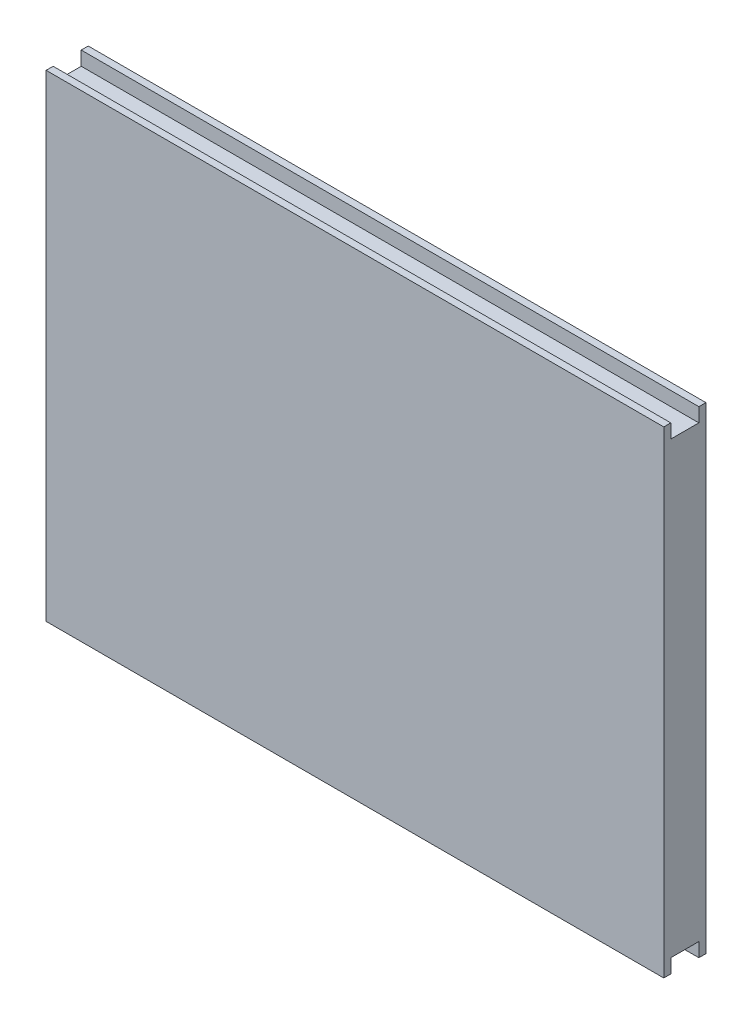
ISO-10303-21;
HEADER;
FILE_DESCRIPTION(('STEP AP214'),'2;1');
FILE_NAME('part.step','',(''),(''),'','','');
FILE_SCHEMA(('AUTOMOTIVE_DESIGN { 1 0 10303 214 1 1 1 1 }'));
ENDSEC;
DATA;
#1=APPLICATION_CONTEXT('core data for automotive mechanical design processes');
#2=APPLICATION_PROTOCOL_DEFINITION('international standard','automotive_design',2000,#1);
#3=PRODUCT_CONTEXT('',#1,'mechanical');
#4=PRODUCT('Part','Part','',(#3));
#5=PRODUCT_RELATED_PRODUCT_CATEGORY('part','',(#4));
#6=PRODUCT_DEFINITION_FORMATION('','',#4);
#7=PRODUCT_DEFINITION_CONTEXT('part definition',#1,'design');
#8=PRODUCT_DEFINITION('design','',#6,#7);
#9=PRODUCT_DEFINITION_SHAPE('','',#8);
#10=(LENGTH_UNIT() NAMED_UNIT(*) SI_UNIT(.MILLI.,.METRE.));
#11=(NAMED_UNIT(*) PLANE_ANGLE_UNIT() SI_UNIT($,.RADIAN.));
#12=(NAMED_UNIT(*) SI_UNIT($,.STERADIAN.) SOLID_ANGLE_UNIT());
#13=UNCERTAINTY_MEASURE_WITH_UNIT(LENGTH_MEASURE(1.E-05),#10,'distance_accuracy_value','');
#14=(GEOMETRIC_REPRESENTATION_CONTEXT(3) GLOBAL_UNCERTAINTY_ASSIGNED_CONTEXT((#13)) GLOBAL_UNIT_ASSIGNED_CONTEXT((#10,
#11,#12)) REPRESENTATION_CONTEXT('',''));
#15=CARTESIAN_POINT('',(0.,0.,0.));
#16=DIRECTION('',(0.,0.,1.));
#17=DIRECTION('',(1.,0.,0.));
#18=AXIS2_PLACEMENT_3D('',#15,#16,#17);
#19=CARTESIAN_POINT('',(220.,-80.,-5.));
#20=DIRECTION('',(0.,0.,-1.));
#21=DIRECTION('',(-1.,0.,0.));
#22=AXIS2_PLACEMENT_3D('',#19,#20,#21);
#23=PLANE('',#22);
#24=DIRECTION('',(0.,-1.,0.));
#25=VECTOR('',#24,1.);
#26=CARTESIAN_POINT('',(0.,-80.,-5.));
#27=LINE('',#26,#25);
#28=CARTESIAN_POINT('',(0.,-80.,-5.));
#29=VERTEX_POINT('',#28);
#30=CARTESIAN_POINT('',(0.,-85.,-5.));
#31=VERTEX_POINT('',#30);
#32=EDGE_CURVE('E154',#29,#31,#27,.T.);
#33=ORIENTED_EDGE('',*,*,#32,.T.);
#34=DIRECTION('',(-1.,0.,0.));
#35=VECTOR('',#34,1.);
#36=CARTESIAN_POINT('',(220.,-85.,-5.));
#37=LINE('',#36,#35);
#38=CARTESIAN_POINT('',(220.,-85.,-5.));
#39=VERTEX_POINT('',#38);
#40=EDGE_CURVE('E11',#39,#31,#37,.T.);
#41=ORIENTED_EDGE('',*,*,#40,.F.);
#42=DIRECTION('',(0.,-1.,0.));
#43=VECTOR('',#42,1.);
#44=CARTESIAN_POINT('',(220.,-80.,-5.));
#45=LINE('',#44,#43);
#46=CARTESIAN_POINT('',(220.,-80.,-5.));
#47=VERTEX_POINT('',#46);
#48=EDGE_CURVE('E176',#47,#39,#45,.T.);
#49=ORIENTED_EDGE('',*,*,#48,.F.);
#50=DIRECTION('',(-1.,0.,0.));
#51=VECTOR('',#50,1.);
#52=CARTESIAN_POINT('',(220.,-80.,-5.));
#53=LINE('',#52,#51);
#54=EDGE_CURVE('E150',#47,#29,#53,.T.);
#55=ORIENTED_EDGE('',*,*,#54,.T.);
#56=EDGE_LOOP('',(#33,#41,#49,#55));
#57=FACE_BOUND('',#56,.T.);
#58=ADVANCED_FACE('F34',(#57),#23,.F.);
#59=CARTESIAN_POINT('',(220.,-85.,-5.));
#60=DIRECTION('',(0.,1.,0.));
#61=DIRECTION('',(0.,0.,1.));
#62=AXIS2_PLACEMENT_3D('',#59,#60,#61);
#63=PLANE('',#62);
#64=DIRECTION('',(0.,0.,-1.));
#65=VECTOR('',#64,1.);
#66=CARTESIAN_POINT('',(0.,-85.,-5.));
#67=LINE('',#66,#65);
#68=CARTESIAN_POINT('',(0.,-85.,-7.5));
#69=VERTEX_POINT('',#68);
#70=EDGE_CURVE('E157',#31,#69,#67,.T.);
#71=ORIENTED_EDGE('',*,*,#70,.T.);
#72=DIRECTION('',(-1.,0.,0.));
#73=VECTOR('',#72,1.);
#74=CARTESIAN_POINT('',(220.,-85.,-7.5));
#75=LINE('',#74,#73);
#76=CARTESIAN_POINT('',(220.,-85.,-7.5));
#77=VERTEX_POINT('',#76);
#78=EDGE_CURVE('E42',#77,#69,#75,.T.);
#79=ORIENTED_EDGE('',*,*,#78,.F.);
#80=DIRECTION('',(0.,0.,-1.));
#81=VECTOR('',#80,1.);
#82=CARTESIAN_POINT('',(220.,-85.,-5.));
#83=LINE('',#82,#81);
#84=EDGE_CURVE('E105',#39,#77,#83,.T.);
#85=ORIENTED_EDGE('',*,*,#84,.F.);
#86=ORIENTED_EDGE('',*,*,#40,.T.);
#87=EDGE_LOOP('',(#71,#79,#85,#86));
#88=FACE_BOUND('',#87,.T.);
#89=ADVANCED_FACE('F254',(#88),#63,.F.);
#90=CARTESIAN_POINT('',(220.,85.,-7.5));
#91=DIRECTION('',(0.,0.,1.));
#92=DIRECTION('',(0.,-1.,0.));
#93=AXIS2_PLACEMENT_3D('',#90,#91,#92);
#94=PLANE('',#93);
#95=DIRECTION('',(0.,1.,0.));
#96=VECTOR('',#95,1.);
#97=CARTESIAN_POINT('',(0.,85.,-7.5));
#98=LINE('',#97,#96);
#99=CARTESIAN_POINT('',(0.,85.,-7.5));
#100=VERTEX_POINT('',#99);
#101=EDGE_CURVE('E159',#69,#100,#98,.T.);
#102=ORIENTED_EDGE('',*,*,#101,.T.);
#103=DIRECTION('',(-1.,0.,0.));
#104=VECTOR('',#103,1.);
#105=CARTESIAN_POINT('',(220.,85.,-7.5));
#106=LINE('',#105,#104);
#107=CARTESIAN_POINT('',(220.,85.,-7.5));
#108=VERTEX_POINT('',#107);
#109=EDGE_CURVE('E195',#108,#100,#106,.T.);
#110=ORIENTED_EDGE('',*,*,#109,.F.);
#111=DIRECTION('',(0.,1.,0.));
#112=VECTOR('',#111,1.);
#113=CARTESIAN_POINT('',(220.,85.,-7.5));
#114=LINE('',#113,#112);
#115=EDGE_CURVE('E203',#77,#108,#114,.T.);
#116=ORIENTED_EDGE('',*,*,#115,.F.);
#117=ORIENTED_EDGE('',*,*,#78,.T.);
#118=EDGE_LOOP('',(#102,#110,#116,#117));
#119=FACE_BOUND('',#118,.T.);
#120=ADVANCED_FACE('F201',(#119),#94,.F.);
#121=CARTESIAN_POINT('',(220.,85.,-5.));
#122=DIRECTION('',(0.,-1.,0.));
#123=DIRECTION('',(0.,0.,-1.));
#124=AXIS2_PLACEMENT_3D('',#121,#122,#123);
#125=PLANE('',#124);
#126=DIRECTION('',(0.,0.,1.));
#127=VECTOR('',#126,1.);
#128=CARTESIAN_POINT('',(0.,85.,-5.));
#129=LINE('',#128,#127);
#130=CARTESIAN_POINT('',(0.,85.,-5.));
#131=VERTEX_POINT('',#130);
#132=EDGE_CURVE('E161',#100,#131,#129,.T.);
#133=ORIENTED_EDGE('',*,*,#132,.T.);
#134=DIRECTION('',(-1.,0.,0.));
#135=VECTOR('',#134,1.);
#136=CARTESIAN_POINT('',(220.,85.,-5.));
#137=LINE('',#136,#135);
#138=CARTESIAN_POINT('',(220.,85.,-5.));
#139=VERTEX_POINT('',#138);
#140=EDGE_CURVE('E192',#139,#131,#137,.T.);
#141=ORIENTED_EDGE('',*,*,#140,.F.);
#142=DIRECTION('',(0.,0.,1.));
#143=VECTOR('',#142,1.);
#144=CARTESIAN_POINT('',(220.,85.,-5.));
#145=LINE('',#144,#143);
#146=EDGE_CURVE('E221',#108,#139,#145,.T.);
#147=ORIENTED_EDGE('',*,*,#146,.F.);
#148=ORIENTED_EDGE('',*,*,#109,.T.);
#149=EDGE_LOOP('',(#133,#141,#147,#148));
#150=FACE_BOUND('',#149,.T.);
#151=ADVANCED_FACE('F212',(#150),#125,.F.);
#152=CARTESIAN_POINT('',(220.,80.,-5.));
#153=DIRECTION('',(0.,0.,-1.));
#154=DIRECTION('',(-1.,0.,0.));
#155=AXIS2_PLACEMENT_3D('',#152,#153,#154);
#156=PLANE('',#155);
#157=DIRECTION('',(0.,-1.,0.));
#158=VECTOR('',#157,1.);
#159=CARTESIAN_POINT('',(0.,80.,-5.));
#160=LINE('',#159,#158);
#161=CARTESIAN_POINT('',(0.,80.,-5.));
#162=VERTEX_POINT('',#161);
#163=EDGE_CURVE('E163',#131,#162,#160,.T.);
#164=ORIENTED_EDGE('',*,*,#163,.T.);
#165=DIRECTION('',(-1.,0.,0.));
#166=VECTOR('',#165,1.);
#167=CARTESIAN_POINT('',(220.,80.,-5.));
#168=LINE('',#167,#166);
#169=CARTESIAN_POINT('',(220.,80.,-5.));
#170=VERTEX_POINT('',#169);
#171=EDGE_CURVE('E189',#170,#162,#168,.T.);
#172=ORIENTED_EDGE('',*,*,#171,.F.);
#173=DIRECTION('',(0.,-1.,0.));
#174=VECTOR('',#173,1.);
#175=CARTESIAN_POINT('',(220.,80.,-5.));
#176=LINE('',#175,#174);
#177=EDGE_CURVE('E218',#139,#170,#176,.T.);
#178=ORIENTED_EDGE('',*,*,#177,.F.);
#179=ORIENTED_EDGE('',*,*,#140,.T.);
#180=EDGE_LOOP('',(#164,#172,#178,#179));
#181=FACE_BOUND('',#180,.T.);
#182=ADVANCED_FACE('F216',(#181),#156,.F.);
#183=CARTESIAN_POINT('',(220.,80.,5.));
#184=DIRECTION('',(0.,-1.,0.));
#185=DIRECTION('',(0.,0.,-1.));
#186=AXIS2_PLACEMENT_3D('',#183,#184,#185);
#187=PLANE('',#186);
#188=DIRECTION('',(0.,0.,1.));
#189=VECTOR('',#188,1.);
#190=CARTESIAN_POINT('',(0.,80.,5.));
#191=LINE('',#190,#189);
#192=CARTESIAN_POINT('',(0.,80.,5.));
#193=VERTEX_POINT('',#192);
#194=EDGE_CURVE('E165',#162,#193,#191,.T.);
#195=ORIENTED_EDGE('',*,*,#194,.T.);
#196=DIRECTION('',(-1.,0.,0.));
#197=VECTOR('',#196,1.);
#198=CARTESIAN_POINT('',(220.,80.,5.));
#199=LINE('',#198,#197);
#200=CARTESIAN_POINT('',(220.,80.,5.));
#201=VERTEX_POINT('',#200);
#202=EDGE_CURVE('E186',#201,#193,#199,.T.);
#203=ORIENTED_EDGE('',*,*,#202,.F.);
#204=DIRECTION('',(0.,0.,1.));
#205=VECTOR('',#204,1.);
#206=CARTESIAN_POINT('',(220.,80.,5.));
#207=LINE('',#206,#205);
#208=EDGE_CURVE('E220',#170,#201,#207,.T.);
#209=ORIENTED_EDGE('',*,*,#208,.F.);
#210=ORIENTED_EDGE('',*,*,#171,.T.);
#211=EDGE_LOOP('',(#195,#203,#209,#210));
#212=FACE_BOUND('',#211,.T.);
#213=ADVANCED_FACE('F267',(#212),#187,.F.);
#214=CARTESIAN_POINT('',(220.,85.,5.));
#215=DIRECTION('',(0.,0.,1.));
#216=DIRECTION('',(0.,-1.,0.));
#217=AXIS2_PLACEMENT_3D('',#214,#215,#216);
#218=PLANE('',#217);
#219=DIRECTION('',(0.,1.,0.));
#220=VECTOR('',#219,1.);
#221=CARTESIAN_POINT('',(0.,85.,5.));
#222=LINE('',#221,#220);
#223=CARTESIAN_POINT('',(0.,85.,5.));
#224=VERTEX_POINT('',#223);
#225=EDGE_CURVE('E167',#193,#224,#222,.T.);
#226=ORIENTED_EDGE('',*,*,#225,.T.);
#227=DIRECTION('',(-1.,0.,0.));
#228=VECTOR('',#227,1.);
#229=CARTESIAN_POINT('',(220.,85.,5.));
#230=LINE('',#229,#228);
#231=CARTESIAN_POINT('',(220.,85.,5.));
#232=VERTEX_POINT('',#231);
#233=EDGE_CURVE('E183',#232,#224,#230,.T.);
#234=ORIENTED_EDGE('',*,*,#233,.F.);
#235=DIRECTION('',(0.,1.,0.));
#236=VECTOR('',#235,1.);
#237=CARTESIAN_POINT('',(220.,85.,5.));
#238=LINE('',#237,#236);
#239=EDGE_CURVE('E223',#201,#232,#238,.T.);
#240=ORIENTED_EDGE('',*,*,#239,.F.);
#241=ORIENTED_EDGE('',*,*,#202,.T.);
#242=EDGE_LOOP('',(#226,#234,#240,#241));
#243=FACE_BOUND('',#242,.T.);
#244=ADVANCED_FACE('F270',(#243),#218,.F.);
#245=CARTESIAN_POINT('',(220.,85.,5.));
#246=DIRECTION('',(0.,-1.,0.));
#247=DIRECTION('',(0.,0.,-1.));
#248=AXIS2_PLACEMENT_3D('',#245,#246,#247);
#249=PLANE('',#248);
#250=DIRECTION('',(0.,0.,1.));
#251=VECTOR('',#250,1.);
#252=CARTESIAN_POINT('',(0.,85.,5.));
#253=LINE('',#252,#251);
#254=CARTESIAN_POINT('',(0.,85.,7.5));
#255=VERTEX_POINT('',#254);
#256=EDGE_CURVE('E169',#224,#255,#253,.T.);
#257=ORIENTED_EDGE('',*,*,#256,.T.);
#258=DIRECTION('',(-1.,0.,0.));
#259=VECTOR('',#258,1.);
#260=CARTESIAN_POINT('',(220.,85.,7.5));
#261=LINE('',#260,#259);
#262=CARTESIAN_POINT('',(220.,85.,7.5));
#263=VERTEX_POINT('',#262);
#264=EDGE_CURVE('E180',#263,#255,#261,.T.);
#265=ORIENTED_EDGE('',*,*,#264,.F.);
#266=DIRECTION('',(0.,0.,1.));
#267=VECTOR('',#266,1.);
#268=CARTESIAN_POINT('',(220.,85.,5.));
#269=LINE('',#268,#267);
#270=EDGE_CURVE('E229',#232,#263,#269,.T.);
#271=ORIENTED_EDGE('',*,*,#270,.F.);
#272=ORIENTED_EDGE('',*,*,#233,.T.);
#273=EDGE_LOOP('',(#257,#265,#271,#272));
#274=FACE_BOUND('',#273,.T.);
#275=ADVANCED_FACE('F235',(#274),#249,.F.);
#276=CARTESIAN_POINT('',(220.,85.,7.5));
#277=DIRECTION('',(0.,0.,-1.));
#278=DIRECTION('',(0.,1.,0.));
#279=AXIS2_PLACEMENT_3D('',#276,#277,#278);
#280=PLANE('',#279);
#281=DIRECTION('',(0.,-1.,0.));
#282=VECTOR('',#281,1.);
#283=CARTESIAN_POINT('',(0.,85.,7.5));
#284=LINE('',#283,#282);
#285=CARTESIAN_POINT('',(0.,-85.,7.5));
#286=VERTEX_POINT('',#285);
#287=EDGE_CURVE('E171',#255,#286,#284,.T.);
#288=ORIENTED_EDGE('',*,*,#287,.T.);
#289=DIRECTION('',(-1.,0.,0.));
#290=VECTOR('',#289,1.);
#291=CARTESIAN_POINT('',(220.,-85.,7.5));
#292=LINE('',#291,#290);
#293=CARTESIAN_POINT('',(220.,-85.,7.5));
#294=VERTEX_POINT('',#293);
#295=EDGE_CURVE('E145',#294,#286,#292,.T.);
#296=ORIENTED_EDGE('',*,*,#295,.F.);
#297=DIRECTION('',(0.,-1.,0.));
#298=VECTOR('',#297,1.);
#299=CARTESIAN_POINT('',(220.,85.,7.5));
#300=LINE('',#299,#298);
#301=EDGE_CURVE('E136',#263,#294,#300,.T.);
#302=ORIENTED_EDGE('',*,*,#301,.F.);
#303=ORIENTED_EDGE('',*,*,#264,.T.);
#304=EDGE_LOOP('',(#288,#296,#302,#303));
#305=FACE_BOUND('',#304,.T.);
#306=ADVANCED_FACE('F239',(#305),#280,.F.);
#307=CARTESIAN_POINT('',(220.,-85.,5.));
#308=DIRECTION('',(0.,1.,0.));
#309=DIRECTION('',(0.,0.,1.));
#310=AXIS2_PLACEMENT_3D('',#307,#308,#309);
#311=PLANE('',#310);
#312=DIRECTION('',(0.,0.,-1.));
#313=VECTOR('',#312,1.);
#314=CARTESIAN_POINT('',(0.,-85.,5.));
#315=LINE('',#314,#313);
#316=CARTESIAN_POINT('',(0.,-85.,5.));
#317=VERTEX_POINT('',#316);
#318=EDGE_CURVE('E144',#286,#317,#315,.T.);
#319=ORIENTED_EDGE('',*,*,#318,.T.);
#320=DIRECTION('',(-1.,0.,0.));
#321=VECTOR('',#320,1.);
#322=CARTESIAN_POINT('',(220.,-85.,5.));
#323=LINE('',#322,#321);
#324=CARTESIAN_POINT('',(220.,-85.,5.));
#325=VERTEX_POINT('',#324);
#326=EDGE_CURVE('E141',#325,#317,#323,.T.);
#327=ORIENTED_EDGE('',*,*,#326,.F.);
#328=DIRECTION('',(0.,0.,-1.));
#329=VECTOR('',#328,1.);
#330=CARTESIAN_POINT('',(220.,-85.,5.));
#331=LINE('',#330,#329);
#332=EDGE_CURVE('E130',#294,#325,#331,.T.);
#333=ORIENTED_EDGE('',*,*,#332,.F.);
#334=ORIENTED_EDGE('',*,*,#295,.T.);
#335=EDGE_LOOP('',(#319,#327,#333,#334));
#336=FACE_BOUND('',#335,.T.);
#337=ADVANCED_FACE('F142',(#336),#311,.F.);
#338=CARTESIAN_POINT('',(220.,-85.,5.));
#339=DIRECTION('',(0.,0.,1.));
#340=DIRECTION('',(0.,-1.,0.));
#341=AXIS2_PLACEMENT_3D('',#338,#339,#340);
#342=PLANE('',#341);
#343=DIRECTION('',(0.,1.,0.));
#344=VECTOR('',#343,1.);
#345=CARTESIAN_POINT('',(0.,-85.,5.));
#346=LINE('',#345,#344);
#347=CARTESIAN_POINT('',(0.,-80.,5.));
#348=VERTEX_POINT('',#347);
#349=EDGE_CURVE('E91',#317,#348,#346,.T.);
#350=ORIENTED_EDGE('',*,*,#349,.T.);
#351=DIRECTION('',(-1.,0.,0.));
#352=VECTOR('',#351,1.);
#353=CARTESIAN_POINT('',(220.,-80.,5.));
#354=LINE('',#353,#352);
#355=CARTESIAN_POINT('',(220.,-80.,5.));
#356=VERTEX_POINT('',#355);
#357=EDGE_CURVE('E146',#356,#348,#354,.T.);
#358=ORIENTED_EDGE('',*,*,#357,.F.);
#359=DIRECTION('',(0.,1.,0.));
#360=VECTOR('',#359,1.);
#361=CARTESIAN_POINT('',(220.,-85.,5.));
#362=LINE('',#361,#360);
#363=EDGE_CURVE('E134',#325,#356,#362,.T.);
#364=ORIENTED_EDGE('',*,*,#363,.F.);
#365=ORIENTED_EDGE('',*,*,#326,.T.);
#366=EDGE_LOOP('',(#350,#358,#364,#365));
#367=FACE_BOUND('',#366,.T.);
#368=ADVANCED_FACE('F148',(#367),#342,.F.);
#369=CARTESIAN_POINT('',(220.,-80.,5.));
#370=DIRECTION('',(0.,1.,0.));
#371=DIRECTION('',(0.,0.,1.));
#372=AXIS2_PLACEMENT_3D('',#369,#370,#371);
#373=PLANE('',#372);
#374=DIRECTION('',(0.,0.,-1.));
#375=VECTOR('',#374,1.);
#376=CARTESIAN_POINT('',(0.,-80.,5.));
#377=LINE('',#376,#375);
#378=EDGE_CURVE('E97',#348,#29,#377,.T.);
#379=ORIENTED_EDGE('',*,*,#378,.T.);
#380=ORIENTED_EDGE('',*,*,#54,.F.);
#381=DIRECTION('',(0.,0.,-1.));
#382=VECTOR('',#381,1.);
#383=CARTESIAN_POINT('',(220.,-80.,5.));
#384=LINE('',#383,#382);
#385=EDGE_CURVE('E50',#356,#47,#384,.T.);
#386=ORIENTED_EDGE('',*,*,#385,.F.);
#387=ORIENTED_EDGE('',*,*,#357,.T.);
#388=EDGE_LOOP('',(#379,#380,#386,#387));
#389=FACE_BOUND('',#388,.T.);
#390=ADVANCED_FACE('F243',(#389),#373,.F.);
#391=CARTESIAN_POINT('',(220.,0.,0.));
#392=DIRECTION('',(1.,0.,0.));
#393=DIRECTION('',(0.,0.,-1.));
#394=AXIS2_PLACEMENT_3D('',#391,#392,#393);
#395=PLANE('',#394);
#396=ORIENTED_EDGE('',*,*,#48,.T.);
#397=ORIENTED_EDGE('',*,*,#84,.T.);
#398=ORIENTED_EDGE('',*,*,#115,.T.);
#399=ORIENTED_EDGE('',*,*,#146,.T.);
#400=ORIENTED_EDGE('',*,*,#177,.T.);
#401=ORIENTED_EDGE('',*,*,#208,.T.);
#402=ORIENTED_EDGE('',*,*,#239,.T.);
#403=ORIENTED_EDGE('',*,*,#270,.T.);
#404=ORIENTED_EDGE('',*,*,#301,.T.);
#405=ORIENTED_EDGE('',*,*,#332,.T.);
#406=ORIENTED_EDGE('',*,*,#363,.T.);
#407=ORIENTED_EDGE('',*,*,#385,.T.);
#408=EDGE_LOOP('',(#396,#397,#398,#399,#400,#401,#402,#403,#404,#405,#406,#407));
#409=FACE_BOUND('',#408,.T.);
#410=ADVANCED_FACE('F132',(#409),#395,.T.);
#411=CARTESIAN_POINT('',(0.,0.,0.));
#412=DIRECTION('',(1.,0.,0.));
#413=DIRECTION('',(0.,0.,-1.));
#414=AXIS2_PLACEMENT_3D('',#411,#412,#413);
#415=PLANE('',#414);
#416=ORIENTED_EDGE('',*,*,#32,.F.);
#417=ORIENTED_EDGE('',*,*,#378,.F.);
#418=ORIENTED_EDGE('',*,*,#349,.F.);
#419=ORIENTED_EDGE('',*,*,#318,.F.);
#420=ORIENTED_EDGE('',*,*,#287,.F.);
#421=ORIENTED_EDGE('',*,*,#256,.F.);
#422=ORIENTED_EDGE('',*,*,#225,.F.);
#423=ORIENTED_EDGE('',*,*,#194,.F.);
#424=ORIENTED_EDGE('',*,*,#163,.F.);
#425=ORIENTED_EDGE('',*,*,#132,.F.);
#426=ORIENTED_EDGE('',*,*,#101,.F.);
#427=ORIENTED_EDGE('',*,*,#70,.F.);
#428=EDGE_LOOP('',(#416,#417,#418,#419,#420,#421,#422,#423,#424,#425,#426,#427));
#429=FACE_BOUND('',#428,.T.);
#430=ADVANCED_FACE('F207',(#429),#415,.F.);
#431=CLOSED_SHELL('',(#58,#89,#120,#151,#182,#213,#244,#275,#306,#337,#368,#390,#410,#430));
#432=MANIFOLD_SOLID_BREP('B2',#431);
#433=ADVANCED_BREP_SHAPE_REPRESENTATION('',(#18,#432),#14);
#434=SHAPE_DEFINITION_REPRESENTATION(#9,#433);
ENDSEC;
END-ISO-10303-21;
